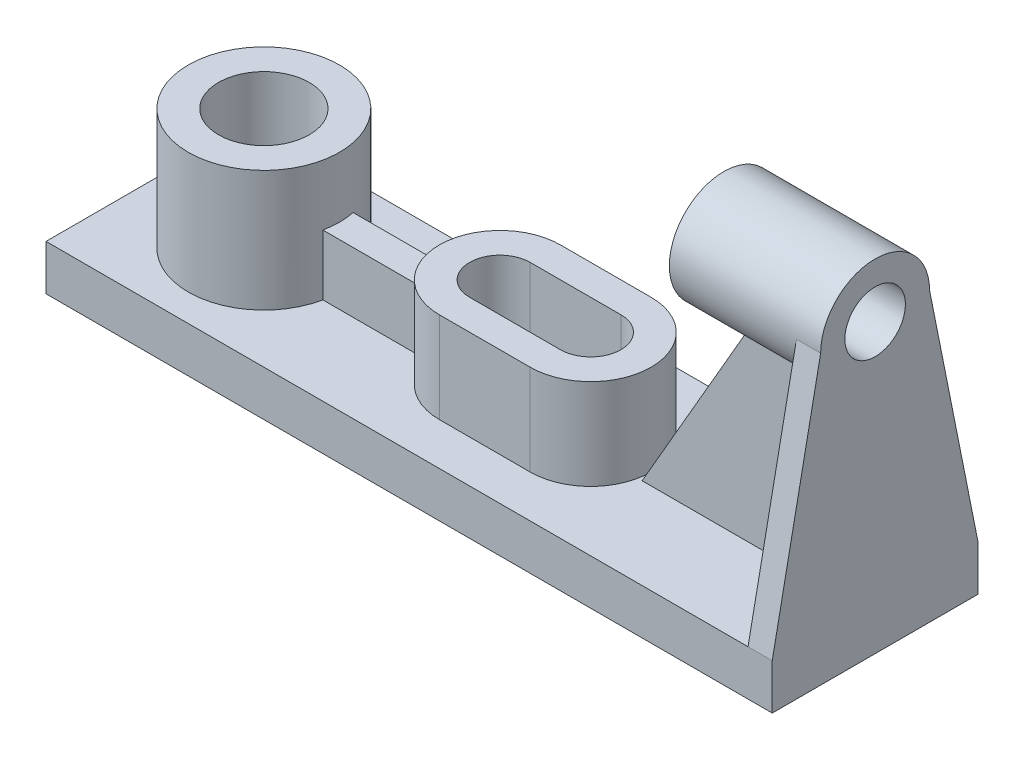
ISO-10303-21;
HEADER;
FILE_DESCRIPTION(('STEP AP214'),'2;1');
FILE_NAME('part.step','',(''),(''),'','','');
FILE_SCHEMA(('AUTOMOTIVE_DESIGN { 1 0 10303 214 1 1 1 1 }'));
ENDSEC;
DATA;
#1=APPLICATION_CONTEXT('core data for automotive mechanical design processes');
#2=APPLICATION_PROTOCOL_DEFINITION('international standard','automotive_design',2000,#1);
#3=PRODUCT_CONTEXT('',#1,'mechanical');
#4=PRODUCT('Part','Part','',(#3));
#5=PRODUCT_RELATED_PRODUCT_CATEGORY('part','',(#4));
#6=PRODUCT_DEFINITION_FORMATION('','',#4);
#7=PRODUCT_DEFINITION_CONTEXT('part definition',#1,'design');
#8=PRODUCT_DEFINITION('design','',#6,#7);
#9=PRODUCT_DEFINITION_SHAPE('','',#8);
#10=(LENGTH_UNIT() NAMED_UNIT(*) SI_UNIT(.MILLI.,.METRE.));
#11=(NAMED_UNIT(*) PLANE_ANGLE_UNIT() SI_UNIT($,.RADIAN.));
#12=(NAMED_UNIT(*) SI_UNIT($,.STERADIAN.) SOLID_ANGLE_UNIT());
#13=UNCERTAINTY_MEASURE_WITH_UNIT(LENGTH_MEASURE(1.E-05),#10,'distance_accuracy_value','');
#14=(GEOMETRIC_REPRESENTATION_CONTEXT(3) GLOBAL_UNCERTAINTY_ASSIGNED_CONTEXT((#13)) GLOBAL_UNIT_ASSIGNED_CONTEXT((#10,
#11,#12)) REPRESENTATION_CONTEXT('',''));
#15=CARTESIAN_POINT('',(0.,0.,0.));
#16=DIRECTION('',(0.,0.,1.));
#17=DIRECTION('',(1.,0.,0.));
#18=AXIS2_PLACEMENT_3D('',#15,#16,#17);
#19=CARTESIAN_POINT('',(112.,95.,0.));
#20=DIRECTION('',(1.,0.,0.));
#21=DIRECTION('',(0.,0.,-1.));
#22=AXIS2_PLACEMENT_3D('',#19,#20,#21);
#23=PLANE('',#22);
#24=DIRECTION('',(0.,-1.,0.));
#25=VECTOR('',#24,1.);
#26=CARTESIAN_POINT('',(112.,95.,-4.));
#27=LINE('',#26,#25);
#28=CARTESIAN_POINT('',(112.,77.4500712252157,-4.));
#29=VERTEX_POINT('',#28);
#30=CARTESIAN_POINT('',(112.,15.,-4.));
#31=VERTEX_POINT('',#30);
#32=EDGE_CURVE('E206',#29,#31,#27,.T.);
#33=ORIENTED_EDGE('',*,*,#32,.F.);
#34=CARTESIAN_POINT('',(112.,95.,0.));
#35=DIRECTION('',(1.,0.,0.));
#36=DIRECTION('',(0.,0.,-1.));
#37=AXIS2_PLACEMENT_3D('',#34,#35,#36);
#38=CIRCLE('',#37,18.);
#39=CARTESIAN_POINT('',(112.,95.,-18.));
#40=VERTEX_POINT('',#39);
#41=EDGE_CURVE('E12',#40,#29,#38,.F.);
#42=ORIENTED_EDGE('',*,*,#41,.F.);
#43=DIRECTION('',(0.,0.98058067569092,0.196116135138183));
#44=VECTOR('',#43,1.);
#45=CARTESIAN_POINT('',(112.,95.,-18.));
#46=LINE('',#45,#44);
#47=CARTESIAN_POINT('',(112.,15.,-34.));
#48=VERTEX_POINT('',#47);
#49=EDGE_CURVE('E254',#48,#40,#46,.T.);
#50=ORIENTED_EDGE('',*,*,#49,.F.);
#51=DIRECTION('',(0.,0.,-1.));
#52=VECTOR('',#51,1.);
#53=CARTESIAN_POINT('',(112.,15.,34.));
#54=LINE('',#53,#52);
#55=EDGE_CURVE('E73',#31,#48,#54,.T.);
#56=ORIENTED_EDGE('',*,*,#55,.F.);
#57=EDGE_LOOP('',(#33,#42,#50,#56));
#58=FACE_BOUND('',#57,.T.);
#59=ADVANCED_FACE('F49',(#58),#23,.F.);
#60=CARTESIAN_POINT('',(112.,77.4500712252158,4.));
#61=VERTEX_POINT('',#60);
#62=CARTESIAN_POINT('',(112.,95.,18.));
#63=VERTEX_POINT('',#62);
#64=EDGE_CURVE('E58',#61,#63,#38,.F.);
#65=ORIENTED_EDGE('',*,*,#64,.F.);
#66=DIRECTION('',(0.,-1.,0.));
#67=VECTOR('',#66,1.);
#68=CARTESIAN_POINT('',(112.,95.,4.));
#69=LINE('',#68,#67);
#70=CARTESIAN_POINT('',(112.,15.,4.));
#71=VERTEX_POINT('',#70);
#72=EDGE_CURVE('E612',#61,#71,#69,.T.);
#73=ORIENTED_EDGE('',*,*,#72,.T.);
#74=CARTESIAN_POINT('',(112.,15.,34.));
#75=VERTEX_POINT('',#74);
#76=EDGE_CURVE('E251',#75,#71,#54,.T.);
#77=ORIENTED_EDGE('',*,*,#76,.F.);
#78=DIRECTION('',(0.,-0.98058067569092,0.196116135138185));
#79=VECTOR('',#78,1.);
#80=CARTESIAN_POINT('',(112.,95.,18.));
#81=LINE('',#80,#79);
#82=EDGE_CURVE('E246',#63,#75,#81,.T.);
#83=ORIENTED_EDGE('',*,*,#82,.F.);
#84=EDGE_LOOP('',(#65,#73,#77,#83));
#85=FACE_BOUND('',#84,.T.);
#86=ADVANCED_FACE('F482',(#85),#23,.F.);
#87=CARTESIAN_POINT('',(0.,15.,0.));
#88=DIRECTION('',(0.,1.,0.));
#89=DIRECTION('',(0.,0.,1.));
#90=AXIS2_PLACEMENT_3D('',#87,#88,#89);
#91=PLANE('',#90);
#92=DIRECTION('',(1.,0.,0.));
#93=VECTOR('',#92,1.);
#94=CARTESIAN_POINT('',(0.,15.,4.));
#95=LINE('',#94,#93);
#96=CARTESIAN_POINT('',(47.,15.,4.));
#97=VERTEX_POINT('',#96);
#98=EDGE_CURVE('E226',#97,#71,#95,.T.);
#99=ORIENTED_EDGE('',*,*,#98,.F.);
#100=DIRECTION('',(0.,0.,1.));
#101=VECTOR('',#100,1.);
#102=CARTESIAN_POINT('',(47.,15.,0.));
#103=LINE('',#102,#101);
#104=CARTESIAN_POINT('',(47.,15.,-4.));
#105=VERTEX_POINT('',#104);
#106=EDGE_CURVE('E214',#105,#97,#103,.T.);
#107=ORIENTED_EDGE('',*,*,#106,.F.);
#108=DIRECTION('',(1.,0.,0.));
#109=VECTOR('',#108,1.);
#110=CARTESIAN_POINT('',(0.,15.,-4.));
#111=LINE('',#110,#109);
#112=EDGE_CURVE('E203',#105,#31,#111,.T.);
#113=ORIENTED_EDGE('',*,*,#112,.T.);
#114=ORIENTED_EDGE('',*,*,#55,.T.);
#115=DIRECTION('',(-1.,0.,0.));
#116=VECTOR('',#115,1.);
#117=CARTESIAN_POINT('',(-120.,15.,-34.));
#118=LINE('',#117,#116);
#119=CARTESIAN_POINT('',(-120.,15.,-34.));
#120=VERTEX_POINT('',#119);
#121=EDGE_CURVE('E419',#48,#120,#118,.T.);
#122=ORIENTED_EDGE('',*,*,#121,.T.);
#123=DIRECTION('',(0.,0.,1.));
#124=VECTOR('',#123,1.);
#125=CARTESIAN_POINT('',(-120.,15.,-34.));
#126=LINE('',#125,#124);
#127=CARTESIAN_POINT('',(-120.,15.,34.));
#128=VERTEX_POINT('',#127);
#129=EDGE_CURVE('E418',#120,#128,#126,.T.);
#130=ORIENTED_EDGE('',*,*,#129,.T.);
#131=DIRECTION('',(1.,0.,0.));
#132=VECTOR('',#131,1.);
#133=CARTESIAN_POINT('',(-120.,15.,34.));
#134=LINE('',#133,#132);
#135=EDGE_CURVE('E422',#128,#75,#134,.T.);
#136=ORIENTED_EDGE('',*,*,#135,.T.);
#137=ORIENTED_EDGE('',*,*,#76,.T.);
#138=EDGE_LOOP('',(#99,#107,#113,#114,#122,#130,#136,#137));
#139=FACE_BOUND('',#138,.T.);
#140=DIRECTION('',(1.,0.,0.));
#141=VECTOR('',#140,1.);
#142=CARTESIAN_POINT('',(0.,15.,5.));
#143=LINE('',#142,#141);
#144=CARTESIAN_POINT('',(-57.5051025721682,15.,5.));
#145=VERTEX_POINT('',#144);
#146=CARTESIAN_POINT('',(-23.3649167310371,15.,5.));
#147=VERTEX_POINT('',#146);
#148=EDGE_CURVE('E299',#145,#147,#143,.T.);
#149=ORIENTED_EDGE('',*,*,#148,.F.);
#150=CARTESIAN_POINT('',(-82.,15.,0.));
#151=DIRECTION('',(0.,1.,0.));
#152=DIRECTION('',(0.,0.,1.));
#153=AXIS2_PLACEMENT_3D('',#150,#151,#152);
#154=CIRCLE('',#153,25.);
#155=CARTESIAN_POINT('',(-57.5051025721682,15.,-5.));
#156=VERTEX_POINT('',#155);
#157=EDGE_CURVE('E406',#156,#145,#154,.T.);
#158=ORIENTED_EDGE('',*,*,#157,.F.);
#159=DIRECTION('',(1.,0.,0.));
#160=VECTOR('',#159,1.);
#161=CARTESIAN_POINT('',(0.,15.,-5.));
#162=LINE('',#161,#160);
#163=CARTESIAN_POINT('',(-23.3649167310371,15.,-5.));
#164=VERTEX_POINT('',#163);
#165=EDGE_CURVE('E287',#156,#164,#162,.T.);
#166=ORIENTED_EDGE('',*,*,#165,.T.);
#167=CARTESIAN_POINT('',(-4.,15.,0.));
#168=DIRECTION('',(0.,1.,0.));
#169=DIRECTION('',(0.,0.,1.));
#170=AXIS2_PLACEMENT_3D('',#167,#168,#169);
#171=CIRCLE('',#170,20.);
#172=CARTESIAN_POINT('',(-4.,15.,-20.));
#173=VERTEX_POINT('',#172);
#174=EDGE_CURVE('E373',#173,#164,#171,.T.);
#175=ORIENTED_EDGE('',*,*,#174,.F.);
#176=DIRECTION('',(1.,0.,0.));
#177=VECTOR('',#176,1.);
#178=CARTESIAN_POINT('',(-4.,15.,-20.));
#179=LINE('',#178,#177);
#180=CARTESIAN_POINT('',(26.,15.,-20.));
#181=VERTEX_POINT('',#180);
#182=EDGE_CURVE('E362',#173,#181,#179,.T.);
#183=ORIENTED_EDGE('',*,*,#182,.T.);
#184=CARTESIAN_POINT('',(26.,15.,0.));
#185=DIRECTION('',(0.,1.,0.));
#186=DIRECTION('',(0.,0.,1.));
#187=AXIS2_PLACEMENT_3D('',#184,#185,#186);
#188=CIRCLE('',#187,20.);
#189=CARTESIAN_POINT('',(26.,15.,20.));
#190=VERTEX_POINT('',#189);
#191=EDGE_CURVE('E380',#190,#181,#188,.T.);
#192=ORIENTED_EDGE('',*,*,#191,.F.);
#193=DIRECTION('',(1.,0.,0.));
#194=VECTOR('',#193,1.);
#195=CARTESIAN_POINT('',(-4.,15.,20.));
#196=LINE('',#195,#194);
#197=CARTESIAN_POINT('',(-4.,15.,20.));
#198=VERTEX_POINT('',#197);
#199=EDGE_CURVE('E376',#198,#190,#196,.T.);
#200=ORIENTED_EDGE('',*,*,#199,.F.);
#201=EDGE_CURVE('E356',#147,#198,#171,.T.);
#202=ORIENTED_EDGE('',*,*,#201,.F.);
#203=EDGE_LOOP('',(#149,#158,#166,#175,#183,#192,#200,#202));
#204=FACE_BOUND('',#203,.T.);
#205=ADVANCED_FACE('F223',(#139,#204),#91,.T.);
#206=CARTESIAN_POINT('',(120.,15.,-34.));
#207=DIRECTION('',(-1.,0.,0.));
#208=DIRECTION('',(0.,0.,1.));
#209=AXIS2_PLACEMENT_3D('',#206,#207,#208);
#210=PLANE('',#209);
#211=CARTESIAN_POINT('',(120.,95.,0.));
#212=DIRECTION('',(-1.,0.,0.));
#213=DIRECTION('',(0.,0.,1.));
#214=AXIS2_PLACEMENT_3D('',#211,#212,#213);
#215=CIRCLE('',#214,10.);
#216=CARTESIAN_POINT('',(120.,95.,9.99999999999995));
#217=VERTEX_POINT('',#216);
#218=EDGE_CURVE('E233',#217,#217,#215,.T.);
#219=ORIENTED_EDGE('',*,*,#218,.T.);
#220=EDGE_LOOP('',(#219));
#221=FACE_BOUND('',#220,.T.);
#222=DIRECTION('',(0.,0.,-1.));
#223=VECTOR('',#222,1.);
#224=CARTESIAN_POINT('',(120.,0.,-34.));
#225=LINE('',#224,#223);
#226=CARTESIAN_POINT('',(120.,0.,34.));
#227=VERTEX_POINT('',#226);
#228=CARTESIAN_POINT('',(120.,0.,-34.));
#229=VERTEX_POINT('',#228);
#230=EDGE_CURVE('E411',#227,#229,#225,.T.);
#231=ORIENTED_EDGE('',*,*,#230,.T.);
#232=DIRECTION('',(0.,-1.,0.));
#233=VECTOR('',#232,1.);
#234=CARTESIAN_POINT('',(120.,15.,-34.));
#235=LINE('',#234,#233);
#236=CARTESIAN_POINT('',(120.,15.,-34.));
#237=VERTEX_POINT('',#236);
#238=EDGE_CURVE('E449',#237,#229,#235,.T.);
#239=ORIENTED_EDGE('',*,*,#238,.F.);
#240=DIRECTION('',(0.,0.98058067569092,0.196116135138183));
#241=VECTOR('',#240,1.);
#242=CARTESIAN_POINT('',(120.,95.,-18.));
#243=LINE('',#242,#241);
#244=CARTESIAN_POINT('',(120.,95.,-18.));
#245=VERTEX_POINT('',#244);
#246=EDGE_CURVE('E250',#237,#245,#243,.T.);
#247=ORIENTED_EDGE('',*,*,#246,.T.);
#248=CARTESIAN_POINT('',(120.,95.,0.));
#249=DIRECTION('',(1.,0.,0.));
#250=DIRECTION('',(0.,0.,-1.));
#251=AXIS2_PLACEMENT_3D('',#248,#249,#250);
#252=CIRCLE('',#251,18.);
#253=CARTESIAN_POINT('',(120.,95.,17.9999999999999));
#254=VERTEX_POINT('',#253);
#255=EDGE_CURVE('E245',#245,#254,#252,.T.);
#256=ORIENTED_EDGE('',*,*,#255,.T.);
#257=DIRECTION('',(0.,-0.98058067569092,0.196116135138185));
#258=VECTOR('',#257,1.);
#259=CARTESIAN_POINT('',(120.,95.,17.9999999999999));
#260=LINE('',#259,#258);
#261=CARTESIAN_POINT('',(120.,15.,34.));
#262=VERTEX_POINT('',#261);
#263=EDGE_CURVE('E261',#254,#262,#260,.T.);
#264=ORIENTED_EDGE('',*,*,#263,.T.);
#265=DIRECTION('',(0.,-1.,0.));
#266=VECTOR('',#265,1.);
#267=CARTESIAN_POINT('',(120.,15.,34.));
#268=LINE('',#267,#266);
#269=EDGE_CURVE('E426',#262,#227,#268,.T.);
#270=ORIENTED_EDGE('',*,*,#269,.T.);
#271=EDGE_LOOP('',(#231,#239,#247,#256,#264,#270));
#272=FACE_BOUND('',#271,.T.);
#273=ADVANCED_FACE('F51',(#221,#272),#210,.F.);
#274=CARTESIAN_POINT('',(-120.,15.,-34.));
#275=DIRECTION('',(0.,0.,1.));
#276=DIRECTION('',(1.,0.,0.));
#277=AXIS2_PLACEMENT_3D('',#274,#275,#276);
#278=PLANE('',#277);
#279=DIRECTION('',(-1.,0.,0.));
#280=VECTOR('',#279,1.);
#281=CARTESIAN_POINT('',(-120.,0.,-34.));
#282=LINE('',#281,#280);
#283=CARTESIAN_POINT('',(-120.,0.,-34.));
#284=VERTEX_POINT('',#283);
#285=EDGE_CURVE('E429',#229,#284,#282,.T.);
#286=ORIENTED_EDGE('',*,*,#285,.T.);
#287=DIRECTION('',(0.,-1.,0.));
#288=VECTOR('',#287,1.);
#289=CARTESIAN_POINT('',(-120.,15.,-34.));
#290=LINE('',#289,#288);
#291=EDGE_CURVE('E445',#120,#284,#290,.T.);
#292=ORIENTED_EDGE('',*,*,#291,.F.);
#293=ORIENTED_EDGE('',*,*,#121,.F.);
#294=EDGE_CURVE('E414',#237,#48,#118,.T.);
#295=ORIENTED_EDGE('',*,*,#294,.F.);
#296=ORIENTED_EDGE('',*,*,#238,.T.);
#297=EDGE_LOOP('',(#286,#292,#293,#295,#296));
#298=FACE_BOUND('',#297,.T.);
#299=ADVANCED_FACE('F581',(#298),#278,.F.);
#300=CARTESIAN_POINT('',(-120.,15.,-34.));
#301=DIRECTION('',(1.,0.,0.));
#302=DIRECTION('',(0.,0.,-1.));
#303=AXIS2_PLACEMENT_3D('',#300,#301,#302);
#304=PLANE('',#303);
#305=DIRECTION('',(0.,-1.,0.));
#306=VECTOR('',#305,1.);
#307=CARTESIAN_POINT('',(-120.,15.,34.));
#308=LINE('',#307,#306);
#309=CARTESIAN_POINT('',(-120.,0.,34.));
#310=VERTEX_POINT('',#309);
#311=EDGE_CURVE('E441',#128,#310,#308,.T.);
#312=ORIENTED_EDGE('',*,*,#311,.F.);
#313=ORIENTED_EDGE('',*,*,#129,.F.);
#314=ORIENTED_EDGE('',*,*,#291,.T.);
#315=DIRECTION('',(0.,0.,1.));
#316=VECTOR('',#315,1.);
#317=CARTESIAN_POINT('',(-120.,0.,-34.));
#318=LINE('',#317,#316);
#319=EDGE_CURVE('E432',#284,#310,#318,.T.);
#320=ORIENTED_EDGE('',*,*,#319,.T.);
#321=EDGE_LOOP('',(#312,#313,#314,#320));
#322=FACE_BOUND('',#321,.T.);
#323=ADVANCED_FACE('F586',(#322),#304,.F.);
#324=CARTESIAN_POINT('',(-120.,15.,34.));
#325=DIRECTION('',(0.,0.,-1.));
#326=DIRECTION('',(-1.,0.,0.));
#327=AXIS2_PLACEMENT_3D('',#324,#325,#326);
#328=PLANE('',#327);
#329=DIRECTION('',(1.,0.,0.));
#330=VECTOR('',#329,1.);
#331=CARTESIAN_POINT('',(-120.,0.,34.));
#332=LINE('',#331,#330);
#333=EDGE_CURVE('E435',#310,#227,#332,.T.);
#334=ORIENTED_EDGE('',*,*,#333,.T.);
#335=ORIENTED_EDGE('',*,*,#269,.F.);
#336=DIRECTION('',(1.,0.,0.));
#337=VECTOR('',#336,1.);
#338=CARTESIAN_POINT('',(112.,15.,34.));
#339=LINE('',#338,#337);
#340=EDGE_CURVE('E272',#75,#262,#339,.T.);
#341=ORIENTED_EDGE('',*,*,#340,.F.);
#342=ORIENTED_EDGE('',*,*,#135,.F.);
#343=ORIENTED_EDGE('',*,*,#311,.T.);
#344=EDGE_LOOP('',(#334,#335,#341,#342,#343));
#345=FACE_BOUND('',#344,.T.);
#346=ADVANCED_FACE('F478',(#345),#328,.F.);
#347=CARTESIAN_POINT('',(0.,0.,0.));
#348=DIRECTION('',(0.,1.,0.));
#349=DIRECTION('',(0.,0.,1.));
#350=AXIS2_PLACEMENT_3D('',#347,#348,#349);
#351=PLANE('',#350);
#352=ORIENTED_EDGE('',*,*,#285,.F.);
#353=ORIENTED_EDGE('',*,*,#230,.F.);
#354=ORIENTED_EDGE('',*,*,#333,.F.);
#355=ORIENTED_EDGE('',*,*,#319,.F.);
#356=EDGE_LOOP('',(#352,#353,#354,#355));
#357=FACE_BOUND('',#356,.T.);
#358=CARTESIAN_POINT('',(-82.,0.,0.));
#359=DIRECTION('',(0.,1.,0.));
#360=DIRECTION('',(0.,0.,1.));
#361=AXIS2_PLACEMENT_3D('',#358,#359,#360);
#362=CIRCLE('',#361,15.);
#363=CARTESIAN_POINT('',(-82.,0.,15.));
#364=VERTEX_POINT('',#363);
#365=EDGE_CURVE('E401',#364,#364,#362,.T.);
#366=ORIENTED_EDGE('',*,*,#365,.T.);
#367=EDGE_LOOP('',(#366));
#368=FACE_BOUND('',#367,.T.);
#369=CARTESIAN_POINT('',(-4.,0.,0.));
#370=DIRECTION('',(0.,1.,0.));
#371=DIRECTION('',(0.,0.,1.));
#372=AXIS2_PLACEMENT_3D('',#369,#370,#371);
#373=CIRCLE('',#372,10.);
#374=CARTESIAN_POINT('',(-4.,0.,-10.));
#375=VERTEX_POINT('',#374);
#376=CARTESIAN_POINT('',(-4.,0.,10.));
#377=VERTEX_POINT('',#376);
#378=EDGE_CURVE('E353',#375,#377,#373,.T.);
#379=ORIENTED_EDGE('',*,*,#378,.T.);
#380=DIRECTION('',(1.,0.,0.));
#381=VECTOR('',#380,1.);
#382=CARTESIAN_POINT('',(0.,0.,10.));
#383=LINE('',#382,#381);
#384=CARTESIAN_POINT('',(26.,0.,10.));
#385=VERTEX_POINT('',#384);
#386=EDGE_CURVE('E333',#377,#385,#383,.T.);
#387=ORIENTED_EDGE('',*,*,#386,.T.);
#388=CARTESIAN_POINT('',(26.,0.,0.));
#389=DIRECTION('',(0.,1.,0.));
#390=DIRECTION('',(0.,0.,1.));
#391=AXIS2_PLACEMENT_3D('',#388,#389,#390);
#392=CIRCLE('',#391,10.);
#393=CARTESIAN_POINT('',(26.,0.,-10.));
#394=VERTEX_POINT('',#393);
#395=EDGE_CURVE('E346',#385,#394,#392,.T.);
#396=ORIENTED_EDGE('',*,*,#395,.T.);
#397=DIRECTION('',(-1.,0.,0.));
#398=VECTOR('',#397,1.);
#399=CARTESIAN_POINT('',(0.,0.,-10.));
#400=LINE('',#399,#398);
#401=EDGE_CURVE('E349',#394,#375,#400,.T.);
#402=ORIENTED_EDGE('',*,*,#401,.T.);
#403=EDGE_LOOP('',(#379,#387,#396,#402));
#404=FACE_BOUND('',#403,.T.);
#405=ADVANCED_FACE('F456',(#357,#368,#404),#351,.F.);
#406=CARTESIAN_POINT('',(-82.,55.,0.));
#407=DIRECTION('',(0.,1.,0.));
#408=DIRECTION('',(0.,0.,1.));
#409=AXIS2_PLACEMENT_3D('',#406,#407,#408);
#410=PLANE('',#409);
#411=CARTESIAN_POINT('',(-82.,55.,0.));
#412=DIRECTION('',(0.,1.,0.));
#413=DIRECTION('',(0.,0.,1.));
#414=AXIS2_PLACEMENT_3D('',#411,#412,#413);
#415=CIRCLE('',#414,25.);
#416=CARTESIAN_POINT('',(-82.,55.,25.));
#417=VERTEX_POINT('',#416);
#418=EDGE_CURVE('E407',#417,#417,#415,.T.);
#419=ORIENTED_EDGE('',*,*,#418,.T.);
#420=EDGE_LOOP('',(#419));
#421=FACE_BOUND('',#420,.T.);
#422=CARTESIAN_POINT('',(-82.,55.,0.));
#423=DIRECTION('',(0.,1.,0.));
#424=DIRECTION('',(0.,0.,1.));
#425=AXIS2_PLACEMENT_3D('',#422,#423,#424);
#426=CIRCLE('',#425,15.);
#427=CARTESIAN_POINT('',(-82.,55.,15.));
#428=VERTEX_POINT('',#427);
#429=EDGE_CURVE('E402',#428,#428,#426,.T.);
#430=ORIENTED_EDGE('',*,*,#429,.F.);
#431=EDGE_LOOP('',(#430));
#432=FACE_BOUND('',#431,.T.);
#433=ADVANCED_FACE('F467',(#421,#432),#410,.T.);
#434=CARTESIAN_POINT('',(-82.,55.,0.));
#435=DIRECTION('',(0.,-1.,0.));
#436=DIRECTION('',(0.,0.,-1.));
#437=AXIS2_PLACEMENT_3D('',#434,#435,#436);
#438=CYLINDRICAL_SURFACE('',#437,25.);
#439=ORIENTED_EDGE('',*,*,#157,.T.);
#440=DIRECTION('',(0.,-1.,0.));
#441=VECTOR('',#440,1.);
#442=CARTESIAN_POINT('',(-57.5051025721682,55.,5.));
#443=LINE('',#442,#441);
#444=CARTESIAN_POINT('',(-57.5051025721682,35.,5.));
#445=VERTEX_POINT('',#444);
#446=EDGE_CURVE('E303',#145,#445,#443,.F.);
#447=ORIENTED_EDGE('',*,*,#446,.T.);
#448=CARTESIAN_POINT('',(-82.,35.,0.));
#449=DIRECTION('',(0.,-1.,0.));
#450=DIRECTION('',(0.,0.,-1.));
#451=AXIS2_PLACEMENT_3D('',#448,#449,#450);
#452=CIRCLE('',#451,25.);
#453=CARTESIAN_POINT('',(-57.5051025721682,35.,-5.));
#454=VERTEX_POINT('',#453);
#455=EDGE_CURVE('E311',#445,#454,#452,.F.);
#456=ORIENTED_EDGE('',*,*,#455,.T.);
#457=DIRECTION('',(0.,-1.,0.));
#458=VECTOR('',#457,1.);
#459=CARTESIAN_POINT('',(-57.5051025721682,55.,-5.));
#460=LINE('',#459,#458);
#461=EDGE_CURVE('E291',#156,#454,#460,.F.);
#462=ORIENTED_EDGE('',*,*,#461,.F.);
#463=EDGE_LOOP('',(#439,#447,#456,#462));
#464=FACE_BOUND('',#463,.T.);
#465=ORIENTED_EDGE('',*,*,#418,.F.);
#466=EDGE_LOOP('',(#465));
#467=FACE_BOUND('',#466,.T.);
#468=ADVANCED_FACE('F463',(#464,#467),#438,.T.);
#469=CARTESIAN_POINT('',(-82.,55.,0.));
#470=DIRECTION('',(0.,-1.,0.));
#471=DIRECTION('',(0.,0.,-1.));
#472=AXIS2_PLACEMENT_3D('',#469,#470,#471);
#473=CYLINDRICAL_SURFACE('',#472,15.);
#474=ORIENTED_EDGE('',*,*,#365,.F.);
#475=EDGE_LOOP('',(#474));
#476=FACE_BOUND('',#475,.T.);
#477=ORIENTED_EDGE('',*,*,#429,.T.);
#478=EDGE_LOOP('',(#477));
#479=FACE_BOUND('',#478,.T.);
#480=ADVANCED_FACE('F459',(#476,#479),#473,.F.);
#481=CARTESIAN_POINT('',(-4.,45.,0.));
#482=DIRECTION('',(0.,-1.,0.));
#483=DIRECTION('',(0.,0.,-1.));
#484=AXIS2_PLACEMENT_3D('',#481,#482,#483);
#485=CYLINDRICAL_SURFACE('',#484,20.);
#486=CARTESIAN_POINT('',(-4.,35.,0.));
#487=DIRECTION('',(0.,-1.,0.));
#488=DIRECTION('',(0.,0.,-1.));
#489=AXIS2_PLACEMENT_3D('',#486,#487,#488);
#490=CIRCLE('',#489,20.);
#491=CARTESIAN_POINT('',(-23.3649167310371,35.,-5.));
#492=VERTEX_POINT('',#491);
#493=CARTESIAN_POINT('',(-23.3649167310371,35.,5.));
#494=VERTEX_POINT('',#493);
#495=EDGE_CURVE('E308',#492,#494,#490,.F.);
#496=ORIENTED_EDGE('',*,*,#495,.T.);
#497=DIRECTION('',(0.,-1.,0.));
#498=VECTOR('',#497,1.);
#499=CARTESIAN_POINT('',(-23.3649167310371,45.,5.));
#500=LINE('',#499,#498);
#501=EDGE_CURVE('E298',#494,#147,#500,.T.);
#502=ORIENTED_EDGE('',*,*,#501,.T.);
#503=ORIENTED_EDGE('',*,*,#201,.T.);
#504=DIRECTION('',(0.,-1.,0.));
#505=VECTOR('',#504,1.);
#506=CARTESIAN_POINT('',(-4.,45.,20.));
#507=LINE('',#506,#505);
#508=CARTESIAN_POINT('',(-4.,45.,20.));
#509=VERTEX_POINT('',#508);
#510=EDGE_CURVE('E397',#509,#198,#507,.T.);
#511=ORIENTED_EDGE('',*,*,#510,.F.);
#512=CARTESIAN_POINT('',(-4.,45.,0.));
#513=DIRECTION('',(0.,1.,0.));
#514=DIRECTION('',(0.,0.,1.));
#515=AXIS2_PLACEMENT_3D('',#512,#513,#514);
#516=CIRCLE('',#515,20.);
#517=CARTESIAN_POINT('',(-4.,45.,-20.));
#518=VERTEX_POINT('',#517);
#519=EDGE_CURVE('E357',#518,#509,#516,.T.);
#520=ORIENTED_EDGE('',*,*,#519,.F.);
#521=DIRECTION('',(0.,-1.,0.));
#522=VECTOR('',#521,1.);
#523=CARTESIAN_POINT('',(-4.,45.,-20.));
#524=LINE('',#523,#522);
#525=EDGE_CURVE('E372',#518,#173,#524,.T.);
#526=ORIENTED_EDGE('',*,*,#525,.T.);
#527=ORIENTED_EDGE('',*,*,#174,.T.);
#528=DIRECTION('',(0.,-1.,0.));
#529=VECTOR('',#528,1.);
#530=CARTESIAN_POINT('',(-23.3649167310371,45.,-5.));
#531=LINE('',#530,#529);
#532=EDGE_CURVE('E283',#492,#164,#531,.T.);
#533=ORIENTED_EDGE('',*,*,#532,.F.);
#534=EDGE_LOOP('',(#496,#502,#503,#511,#520,#526,#527,#533));
#535=FACE_BOUND('',#534,.T.);
#536=ADVANCED_FACE('F462',(#535),#485,.T.);
#537=CARTESIAN_POINT('',(-4.,45.,20.));
#538=DIRECTION('',(0.,0.,-1.));
#539=DIRECTION('',(-1.,0.,0.));
#540=AXIS2_PLACEMENT_3D('',#537,#538,#539);
#541=PLANE('',#540);
#542=ORIENTED_EDGE('',*,*,#199,.T.);
#543=DIRECTION('',(0.,-1.,0.));
#544=VECTOR('',#543,1.);
#545=CARTESIAN_POINT('',(26.,45.,20.));
#546=LINE('',#545,#544);
#547=CARTESIAN_POINT('',(26.,45.,20.));
#548=VERTEX_POINT('',#547);
#549=EDGE_CURVE('E393',#548,#190,#546,.T.);
#550=ORIENTED_EDGE('',*,*,#549,.F.);
#551=DIRECTION('',(1.,0.,0.));
#552=VECTOR('',#551,1.);
#553=CARTESIAN_POINT('',(-4.,45.,20.));
#554=LINE('',#553,#552);
#555=EDGE_CURVE('E361',#509,#548,#554,.T.);
#556=ORIENTED_EDGE('',*,*,#555,.F.);
#557=ORIENTED_EDGE('',*,*,#510,.T.);
#558=EDGE_LOOP('',(#542,#550,#556,#557));
#559=FACE_BOUND('',#558,.T.);
#560=ADVANCED_FACE('F545',(#559),#541,.F.);
#561=CARTESIAN_POINT('',(26.,45.,0.));
#562=DIRECTION('',(0.,-1.,0.));
#563=DIRECTION('',(0.,0.,-1.));
#564=AXIS2_PLACEMENT_3D('',#561,#562,#563);
#565=CYLINDRICAL_SURFACE('',#564,20.);
#566=ORIENTED_EDGE('',*,*,#191,.T.);
#567=DIRECTION('',(0.,-1.,0.));
#568=VECTOR('',#567,1.);
#569=CARTESIAN_POINT('',(26.,45.,-20.));
#570=LINE('',#569,#568);
#571=CARTESIAN_POINT('',(26.,45.,-20.));
#572=VERTEX_POINT('',#571);
#573=EDGE_CURVE('E389',#572,#181,#570,.T.);
#574=ORIENTED_EDGE('',*,*,#573,.F.);
#575=CARTESIAN_POINT('',(26.,45.,0.));
#576=DIRECTION('',(0.,1.,0.));
#577=DIRECTION('',(0.,0.,1.));
#578=AXIS2_PLACEMENT_3D('',#575,#576,#577);
#579=CIRCLE('',#578,20.);
#580=EDGE_CURVE('E365',#548,#572,#579,.T.);
#581=ORIENTED_EDGE('',*,*,#580,.F.);
#582=ORIENTED_EDGE('',*,*,#549,.T.);
#583=EDGE_LOOP('',(#566,#574,#581,#582));
#584=FACE_BOUND('',#583,.T.);
#585=ADVANCED_FACE('F541',(#584),#565,.T.);
#586=CARTESIAN_POINT('',(-4.,45.,-20.));
#587=DIRECTION('',(0.,0.,-1.));
#588=DIRECTION('',(-1.,0.,0.));
#589=AXIS2_PLACEMENT_3D('',#586,#587,#588);
#590=PLANE('',#589);
#591=ORIENTED_EDGE('',*,*,#182,.F.);
#592=ORIENTED_EDGE('',*,*,#525,.F.);
#593=DIRECTION('',(1.,0.,0.));
#594=VECTOR('',#593,1.);
#595=CARTESIAN_POINT('',(-4.,45.,-20.));
#596=LINE('',#595,#594);
#597=EDGE_CURVE('E368',#518,#572,#596,.T.);
#598=ORIENTED_EDGE('',*,*,#597,.T.);
#599=ORIENTED_EDGE('',*,*,#573,.T.);
#600=EDGE_LOOP('',(#591,#592,#598,#599));
#601=FACE_BOUND('',#600,.T.);
#602=ADVANCED_FACE('F537',(#601),#590,.T.);
#603=CARTESIAN_POINT('',(-4.,45.,0.));
#604=DIRECTION('',(0.,1.,0.));
#605=DIRECTION('',(0.,0.,1.));
#606=AXIS2_PLACEMENT_3D('',#603,#604,#605);
#607=PLANE('',#606);
#608=CARTESIAN_POINT('',(-4.,45.,0.));
#609=DIRECTION('',(0.,1.,0.));
#610=DIRECTION('',(0.,0.,1.));
#611=AXIS2_PLACEMENT_3D('',#608,#609,#610);
#612=CIRCLE('',#611,10.);
#613=CARTESIAN_POINT('',(-4.,45.,-10.));
#614=VERTEX_POINT('',#613);
#615=CARTESIAN_POINT('',(-4.,45.,10.));
#616=VERTEX_POINT('',#615);
#617=EDGE_CURVE('E314',#614,#616,#612,.T.);
#618=ORIENTED_EDGE('',*,*,#617,.F.);
#619=DIRECTION('',(-1.,0.,0.));
#620=VECTOR('',#619,1.);
#621=CARTESIAN_POINT('',(26.,45.,-10.));
#622=LINE('',#621,#620);
#623=CARTESIAN_POINT('',(26.,45.,-10.));
#624=VERTEX_POINT('',#623);
#625=EDGE_CURVE('E325',#624,#614,#622,.T.);
#626=ORIENTED_EDGE('',*,*,#625,.F.);
#627=CARTESIAN_POINT('',(26.,45.,0.));
#628=DIRECTION('',(0.,1.,0.));
#629=DIRECTION('',(0.,0.,1.));
#630=AXIS2_PLACEMENT_3D('',#627,#628,#629);
#631=CIRCLE('',#630,10.);
#632=CARTESIAN_POINT('',(26.,45.,10.));
#633=VERTEX_POINT('',#632);
#634=EDGE_CURVE('E321',#633,#624,#631,.T.);
#635=ORIENTED_EDGE('',*,*,#634,.F.);
#636=DIRECTION('',(1.,0.,0.));
#637=VECTOR('',#636,1.);
#638=CARTESIAN_POINT('',(-4.,45.,10.));
#639=LINE('',#638,#637);
#640=EDGE_CURVE('E317',#616,#633,#639,.T.);
#641=ORIENTED_EDGE('',*,*,#640,.F.);
#642=EDGE_LOOP('',(#618,#626,#635,#641));
#643=FACE_BOUND('',#642,.T.);
#644=ORIENTED_EDGE('',*,*,#519,.T.);
#645=ORIENTED_EDGE('',*,*,#555,.T.);
#646=ORIENTED_EDGE('',*,*,#580,.T.);
#647=ORIENTED_EDGE('',*,*,#597,.F.);
#648=EDGE_LOOP('',(#644,#645,#646,#647));
#649=FACE_BOUND('',#648,.T.);
#650=ADVANCED_FACE('F533',(#643,#649),#607,.T.);
#651=CARTESIAN_POINT('',(-4.,-32.,0.));
#652=DIRECTION('',(0.,1.,0.));
#653=DIRECTION('',(0.,0.,1.));
#654=AXIS2_PLACEMENT_3D('',#651,#652,#653);
#655=CYLINDRICAL_SURFACE('',#654,10.);
#656=DIRECTION('',(0.,1.,0.));
#657=VECTOR('',#656,1.);
#658=CARTESIAN_POINT('',(-4.,-32.,10.));
#659=LINE('',#658,#657);
#660=EDGE_CURVE('E329',#377,#616,#659,.T.);
#661=ORIENTED_EDGE('',*,*,#660,.F.);
#662=ORIENTED_EDGE('',*,*,#378,.F.);
#663=DIRECTION('',(0.,1.,0.));
#664=VECTOR('',#663,1.);
#665=CARTESIAN_POINT('',(-4.,-32.,-10.));
#666=LINE('',#665,#664);
#667=EDGE_CURVE('E330',#375,#614,#666,.T.);
#668=ORIENTED_EDGE('',*,*,#667,.T.);
#669=ORIENTED_EDGE('',*,*,#617,.T.);
#670=EDGE_LOOP('',(#661,#662,#668,#669));
#671=FACE_BOUND('',#670,.T.);
#672=ADVANCED_FACE('F523',(#671),#655,.F.);
#673=CARTESIAN_POINT('',(26.,-32.,-10.));
#674=DIRECTION('',(0.,0.,-1.));
#675=DIRECTION('',(-1.,0.,0.));
#676=AXIS2_PLACEMENT_3D('',#673,#674,#675);
#677=PLANE('',#676);
#678=DIRECTION('',(0.,1.,0.));
#679=VECTOR('',#678,1.);
#680=CARTESIAN_POINT('',(26.,-32.,-10.));
#681=LINE('',#680,#679);
#682=EDGE_CURVE('E334',#394,#624,#681,.T.);
#683=ORIENTED_EDGE('',*,*,#682,.T.);
#684=ORIENTED_EDGE('',*,*,#625,.T.);
#685=ORIENTED_EDGE('',*,*,#667,.F.);
#686=ORIENTED_EDGE('',*,*,#401,.F.);
#687=EDGE_LOOP('',(#683,#684,#685,#686));
#688=FACE_BOUND('',#687,.T.);
#689=ADVANCED_FACE('F519',(#688),#677,.F.);
#690=CARTESIAN_POINT('',(26.,-32.,0.));
#691=DIRECTION('',(0.,1.,0.));
#692=DIRECTION('',(0.,0.,1.));
#693=AXIS2_PLACEMENT_3D('',#690,#691,#692);
#694=CYLINDRICAL_SURFACE('',#693,10.);
#695=ORIENTED_EDGE('',*,*,#682,.F.);
#696=ORIENTED_EDGE('',*,*,#395,.F.);
#697=DIRECTION('',(0.,1.,0.));
#698=VECTOR('',#697,1.);
#699=CARTESIAN_POINT('',(26.,-32.,10.));
#700=LINE('',#699,#698);
#701=EDGE_CURVE('E337',#385,#633,#700,.T.);
#702=ORIENTED_EDGE('',*,*,#701,.T.);
#703=ORIENTED_EDGE('',*,*,#634,.T.);
#704=EDGE_LOOP('',(#695,#696,#702,#703));
#705=FACE_BOUND('',#704,.T.);
#706=ADVANCED_FACE('F522',(#705),#694,.F.);
#707=CARTESIAN_POINT('',(-4.,-32.,10.));
#708=DIRECTION('',(0.,0.,1.));
#709=DIRECTION('',(1.,0.,0.));
#710=AXIS2_PLACEMENT_3D('',#707,#708,#709);
#711=PLANE('',#710);
#712=ORIENTED_EDGE('',*,*,#660,.T.);
#713=ORIENTED_EDGE('',*,*,#640,.T.);
#714=ORIENTED_EDGE('',*,*,#701,.F.);
#715=ORIENTED_EDGE('',*,*,#386,.F.);
#716=EDGE_LOOP('',(#712,#713,#714,#715));
#717=FACE_BOUND('',#716,.T.);
#718=ADVANCED_FACE('F517',(#717),#711,.F.);
#719=CARTESIAN_POINT('',(-57.,35.,0.));
#720=DIRECTION('',(0.,-1.,0.));
#721=DIRECTION('',(1.,0.,0.));
#722=AXIS2_PLACEMENT_3D('',#719,#720,#721);
#723=PLANE('',#722);
#724=ORIENTED_EDGE('',*,*,#455,.F.);
#725=DIRECTION('',(1.,0.,0.));
#726=VECTOR('',#725,1.);
#727=CARTESIAN_POINT('',(0.,35.,5.));
#728=LINE('',#727,#726);
#729=EDGE_CURVE('E279',#445,#494,#728,.T.);
#730=ORIENTED_EDGE('',*,*,#729,.T.);
#731=ORIENTED_EDGE('',*,*,#495,.F.);
#732=DIRECTION('',(1.,0.,0.));
#733=VECTOR('',#732,1.);
#734=CARTESIAN_POINT('',(0.,35.,-5.));
#735=LINE('',#734,#733);
#736=EDGE_CURVE('E271',#454,#492,#735,.T.);
#737=ORIENTED_EDGE('',*,*,#736,.F.);
#738=EDGE_LOOP('',(#724,#730,#731,#737));
#739=FACE_BOUND('',#738,.T.);
#740=ADVANCED_FACE('F510',(#739),#723,.F.);
#741=CARTESIAN_POINT('',(0.,27.5,5.));
#742=DIRECTION('',(0.,0.,1.));
#743=DIRECTION('',(1.,0.,0.));
#744=AXIS2_PLACEMENT_3D('',#741,#742,#743);
#745=PLANE('',#744);
#746=ORIENTED_EDGE('',*,*,#446,.F.);
#747=ORIENTED_EDGE('',*,*,#148,.T.);
#748=ORIENTED_EDGE('',*,*,#501,.F.);
#749=ORIENTED_EDGE('',*,*,#729,.F.);
#750=EDGE_LOOP('',(#746,#747,#748,#749));
#751=FACE_BOUND('',#750,.T.);
#752=ADVANCED_FACE('F507',(#751),#745,.T.);
#753=CARTESIAN_POINT('',(0.,27.5,-5.));
#754=DIRECTION('',(0.,0.,1.));
#755=DIRECTION('',(1.,0.,0.));
#756=AXIS2_PLACEMENT_3D('',#753,#754,#755);
#757=PLANE('',#756);
#758=ORIENTED_EDGE('',*,*,#165,.F.);
#759=ORIENTED_EDGE('',*,*,#461,.T.);
#760=ORIENTED_EDGE('',*,*,#736,.T.);
#761=ORIENTED_EDGE('',*,*,#532,.T.);
#762=EDGE_LOOP('',(#758,#759,#760,#761));
#763=FACE_BOUND('',#762,.T.);
#764=ADVANCED_FACE('F505',(#763),#757,.F.);
#765=CARTESIAN_POINT('',(112.,95.,0.));
#766=DIRECTION('',(1.,0.,0.));
#767=DIRECTION('',(0.,0.,-1.));
#768=AXIS2_PLACEMENT_3D('',#765,#766,#767);
#769=CYLINDRICAL_SURFACE('',#768,18.);
#770=DIRECTION('',(1.,0.,0.));
#771=VECTOR('',#770,1.);
#772=CARTESIAN_POINT('',(112.,95.,18.));
#773=LINE('',#772,#771);
#774=EDGE_CURVE('E258',#63,#254,#773,.T.);
#775=ORIENTED_EDGE('',*,*,#774,.T.);
#776=ORIENTED_EDGE('',*,*,#255,.F.);
#777=DIRECTION('',(1.,0.,0.));
#778=VECTOR('',#777,1.);
#779=CARTESIAN_POINT('',(112.,95.,-18.));
#780=LINE('',#779,#778);
#781=EDGE_CURVE('E268',#40,#245,#780,.T.);
#782=ORIENTED_EDGE('',*,*,#781,.F.);
#783=ORIENTED_EDGE('',*,*,#41,.T.);
#784=DIRECTION('',(1.,0.,0.));
#785=VECTOR('',#784,1.);
#786=CARTESIAN_POINT('',(112.,77.4500712252157,-4.));
#787=LINE('',#786,#785);
#788=CARTESIAN_POINT('',(83.05556543279,77.4500712252157,-3.99999999999999));
#789=VERTEX_POINT('',#788);
#790=EDGE_CURVE('E623',#29,#789,#787,.F.);
#791=ORIENTED_EDGE('',*,*,#790,.T.);
#792=CARTESIAN_POINT('',(93.1880215351705,95.,0.));
#793=DIRECTION('',(-0.866025403784436,0.500000000000004,0.));
#794=DIRECTION('',(0.500000000000004,0.866025403784436,0.));
#795=AXIS2_PLACEMENT_3D('',#792,#793,#794);
#796=ELLIPSE('',#795,20.7846096908266,18.);
#797=CARTESIAN_POINT('',(83.05556543279,77.4500712252158,4.00000000000001));
#798=VERTEX_POINT('',#797);
#799=EDGE_CURVE('E217',#798,#789,#796,.F.);
#800=ORIENTED_EDGE('',*,*,#799,.F.);
#801=DIRECTION('',(1.,0.,0.));
#802=VECTOR('',#801,1.);
#803=CARTESIAN_POINT('',(112.,77.4500712252158,4.));
#804=LINE('',#803,#802);
#805=EDGE_CURVE('E209',#61,#798,#804,.F.);
#806=ORIENTED_EDGE('',*,*,#805,.F.);
#807=ORIENTED_EDGE('',*,*,#64,.T.);
#808=EDGE_LOOP('',(#775,#776,#782,#783,#791,#800,#806,#807));
#809=FACE_BOUND('',#808,.T.);
#810=CARTESIAN_POINT('',(70.,95.,0.));
#811=DIRECTION('',(-1.,0.,0.));
#812=DIRECTION('',(0.,0.,1.));
#813=AXIS2_PLACEMENT_3D('',#810,#811,#812);
#814=CIRCLE('',#813,18.);
#815=CARTESIAN_POINT('',(70.,95.,18.));
#816=VERTEX_POINT('',#815);
#817=EDGE_CURVE('E241',#816,#816,#814,.T.);
#818=ORIENTED_EDGE('',*,*,#817,.F.);
#819=EDGE_LOOP('',(#818));
#820=FACE_BOUND('',#819,.T.);
#821=ADVANCED_FACE('F498',(#809,#820),#769,.T.);
#822=CARTESIAN_POINT('',(112.,95.,-18.));
#823=DIRECTION('',(0.,0.196116135138183,-0.98058067569092));
#824=DIRECTION('',(0.,0.98058067569092,0.196116135138183));
#825=AXIS2_PLACEMENT_3D('',#822,#823,#824);
#826=PLANE('',#825);
#827=ORIENTED_EDGE('',*,*,#246,.F.);
#828=ORIENTED_EDGE('',*,*,#294,.T.);
#829=ORIENTED_EDGE('',*,*,#49,.T.);
#830=ORIENTED_EDGE('',*,*,#781,.T.);
#831=EDGE_LOOP('',(#827,#828,#829,#830));
#832=FACE_BOUND('',#831,.T.);
#833=ADVANCED_FACE('F494',(#832),#826,.T.);
#834=CARTESIAN_POINT('',(112.,95.,18.));
#835=DIRECTION('',(0.,0.196116135138185,0.98058067569092));
#836=DIRECTION('',(0.,-0.98058067569092,0.196116135138185));
#837=AXIS2_PLACEMENT_3D('',#834,#835,#836);
#838=PLANE('',#837);
#839=ORIENTED_EDGE('',*,*,#263,.F.);
#840=ORIENTED_EDGE('',*,*,#774,.F.);
#841=ORIENTED_EDGE('',*,*,#82,.T.);
#842=ORIENTED_EDGE('',*,*,#340,.T.);
#843=EDGE_LOOP('',(#839,#840,#841,#842));
#844=FACE_BOUND('',#843,.T.);
#845=ADVANCED_FACE('F497',(#844),#838,.T.);
#846=CARTESIAN_POINT('',(70.,95.,0.));
#847=DIRECTION('',(-1.,0.,0.));
#848=DIRECTION('',(0.,0.,1.));
#849=AXIS2_PLACEMENT_3D('',#846,#847,#848);
#850=PLANE('',#849);
#851=CARTESIAN_POINT('',(70.,95.,0.));
#852=DIRECTION('',(-1.,0.,0.));
#853=DIRECTION('',(0.,0.,1.));
#854=AXIS2_PLACEMENT_3D('',#851,#852,#853);
#855=CIRCLE('',#854,10.);
#856=CARTESIAN_POINT('',(70.,95.,9.99999999999997));
#857=VERTEX_POINT('',#856);
#858=EDGE_CURVE('E228',#857,#857,#855,.T.);
#859=ORIENTED_EDGE('',*,*,#858,.F.);
#860=EDGE_LOOP('',(#859));
#861=FACE_BOUND('',#860,.T.);
#862=ORIENTED_EDGE('',*,*,#817,.T.);
#863=EDGE_LOOP('',(#862));
#864=FACE_BOUND('',#863,.T.);
#865=ADVANCED_FACE('F492',(#861,#864),#850,.T.);
#866=CARTESIAN_POINT('',(137.,95.,0.));
#867=DIRECTION('',(-1.,0.,0.));
#868=DIRECTION('',(0.,0.,1.));
#869=AXIS2_PLACEMENT_3D('',#866,#867,#868);
#870=CYLINDRICAL_SURFACE('',#869,10.);
#871=ORIENTED_EDGE('',*,*,#218,.F.);
#872=EDGE_LOOP('',(#871));
#873=FACE_BOUND('',#872,.T.);
#874=ORIENTED_EDGE('',*,*,#858,.T.);
#875=EDGE_LOOP('',(#874));
#876=FACE_BOUND('',#875,.T.);
#877=ADVANCED_FACE('F637',(#873,#876),#870,.F.);
#878=CARTESIAN_POINT('',(82.7957166897572,77.,0.));
#879=DIRECTION('',(-0.866025403784436,0.500000000000004,0.));
#880=DIRECTION('',(-0.500000000000004,-0.866025403784436,0.));
#881=AXIS2_PLACEMENT_3D('',#878,#879,#880);
#882=PLANE('',#881);
#883=DIRECTION('',(-0.500000000000004,-0.866025403784436,0.));
#884=VECTOR('',#883,1.);
#885=CARTESIAN_POINT('',(82.7957166897572,77.,-4.));
#886=LINE('',#885,#884);
#887=EDGE_CURVE('E65',#789,#105,#886,.T.);
#888=ORIENTED_EDGE('',*,*,#887,.T.);
#889=ORIENTED_EDGE('',*,*,#106,.T.);
#890=DIRECTION('',(-0.500000000000004,-0.866025403784436,0.));
#891=VECTOR('',#890,1.);
#892=CARTESIAN_POINT('',(82.7957166897572,77.,4.));
#893=LINE('',#892,#891);
#894=EDGE_CURVE('E220',#798,#97,#893,.T.);
#895=ORIENTED_EDGE('',*,*,#894,.F.);
#896=ORIENTED_EDGE('',*,*,#799,.T.);
#897=EDGE_LOOP('',(#888,#889,#895,#896));
#898=FACE_BOUND('',#897,.T.);
#899=ADVANCED_FACE('F212',(#898),#882,.T.);
#900=CARTESIAN_POINT('',(0.,56.5,4.));
#901=DIRECTION('',(0.,0.,1.));
#902=DIRECTION('',(1.,0.,0.));
#903=AXIS2_PLACEMENT_3D('',#900,#901,#902);
#904=PLANE('',#903);
#905=ORIENTED_EDGE('',*,*,#894,.T.);
#906=ORIENTED_EDGE('',*,*,#98,.T.);
#907=ORIENTED_EDGE('',*,*,#72,.F.);
#908=ORIENTED_EDGE('',*,*,#805,.T.);
#909=EDGE_LOOP('',(#905,#906,#907,#908));
#910=FACE_BOUND('',#909,.T.);
#911=ADVANCED_FACE('F627',(#910),#904,.T.);
#912=CARTESIAN_POINT('',(0.,56.5,-4.));
#913=DIRECTION('',(0.,0.,1.));
#914=DIRECTION('',(1.,0.,0.));
#915=AXIS2_PLACEMENT_3D('',#912,#913,#914);
#916=PLANE('',#915);
#917=ORIENTED_EDGE('',*,*,#112,.F.);
#918=ORIENTED_EDGE('',*,*,#887,.F.);
#919=ORIENTED_EDGE('',*,*,#790,.F.);
#920=ORIENTED_EDGE('',*,*,#32,.T.);
#921=EDGE_LOOP('',(#917,#918,#919,#920));
#922=FACE_BOUND('',#921,.T.);
#923=ADVANCED_FACE('F204',(#922),#916,.F.);
#924=CLOSED_SHELL('',(#59,#86,#205,#273,#299,#323,#346,#405,#433,#468,#480,#536,#560,#585,#602,
#650,#672,#689,#706,#718,#740,#752,#764,#821,#833,#845,#865,#877,#899,#911,#923));
#925=MANIFOLD_SOLID_BREP('B2',#924);
#926=ADVANCED_BREP_SHAPE_REPRESENTATION('',(#18,#925),#14);
#927=SHAPE_DEFINITION_REPRESENTATION(#9,#926);
ENDSEC;
END-ISO-10303-21;
